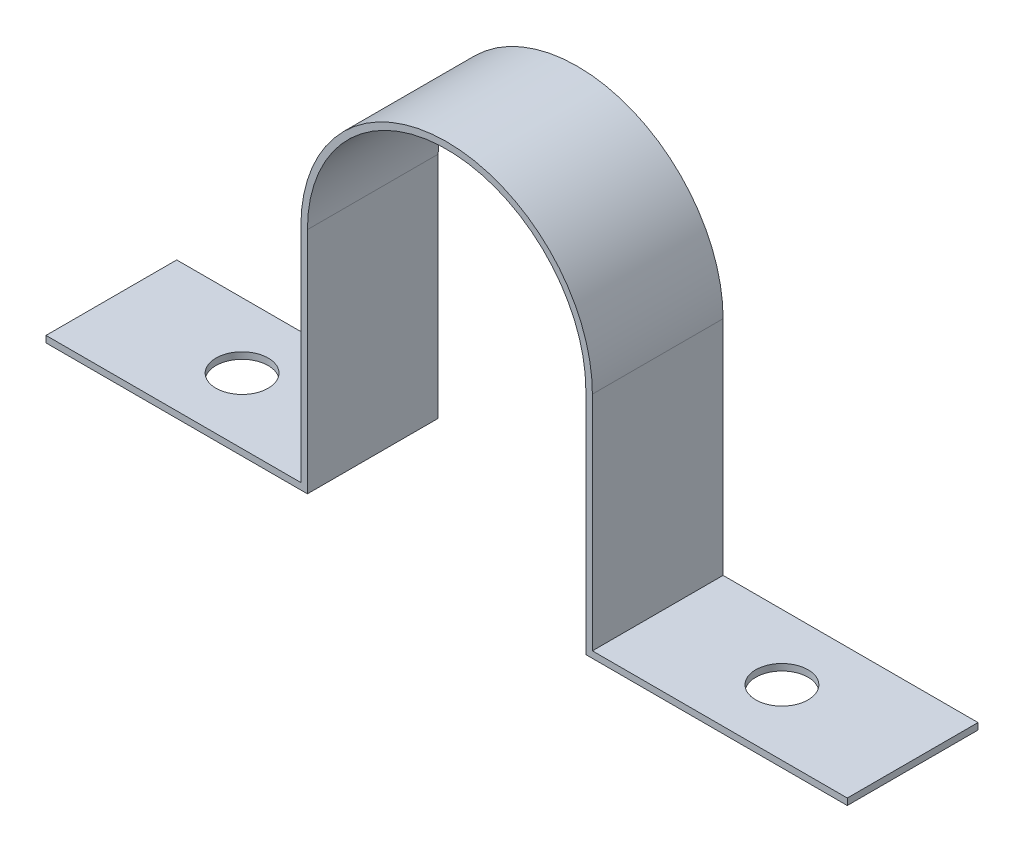
ISO-10303-21;
HEADER;
FILE_DESCRIPTION(('STEP AP214'),'2;1');
FILE_NAME('part.step','',(''),(''),'','','');
FILE_SCHEMA(('AUTOMOTIVE_DESIGN { 1 0 10303 214 1 1 1 1 }'));
ENDSEC;
DATA;
#1=APPLICATION_CONTEXT('core data for automotive mechanical design processes');
#2=APPLICATION_PROTOCOL_DEFINITION('international standard','automotive_design',2000,#1);
#3=PRODUCT_CONTEXT('',#1,'mechanical');
#4=PRODUCT('Part','Part','',(#3));
#5=PRODUCT_RELATED_PRODUCT_CATEGORY('part','',(#4));
#6=PRODUCT_DEFINITION_FORMATION('','',#4);
#7=PRODUCT_DEFINITION_CONTEXT('part definition',#1,'design');
#8=PRODUCT_DEFINITION('design','',#6,#7);
#9=PRODUCT_DEFINITION_SHAPE('','',#8);
#10=(LENGTH_UNIT() NAMED_UNIT(*) SI_UNIT(.MILLI.,.METRE.));
#11=(NAMED_UNIT(*) PLANE_ANGLE_UNIT() SI_UNIT($,.RADIAN.));
#12=(NAMED_UNIT(*) SI_UNIT($,.STERADIAN.) SOLID_ANGLE_UNIT());
#13=UNCERTAINTY_MEASURE_WITH_UNIT(LENGTH_MEASURE(1.E-05),#10,'distance_accuracy_value','');
#14=(GEOMETRIC_REPRESENTATION_CONTEXT(3) GLOBAL_UNCERTAINTY_ASSIGNED_CONTEXT((#13)) GLOBAL_UNIT_ASSIGNED_CONTEXT((#10,
#11,#12)) REPRESENTATION_CONTEXT('',''));
#15=CARTESIAN_POINT('',(0.,0.,0.));
#16=DIRECTION('',(0.,0.,1.));
#17=DIRECTION('',(1.,0.,0.));
#18=AXIS2_PLACEMENT_3D('',#15,#16,#17);
#19=CARTESIAN_POINT('',(0.,0.,10.));
#20=DIRECTION('',(0.,0.,-1.));
#21=DIRECTION('',(-1.,0.,0.));
#22=AXIS2_PLACEMENT_3D('',#19,#20,#21);
#23=CYLINDRICAL_SURFACE('',#22,11.15);
#24=CARTESIAN_POINT('',(0.,0.,0.));
#25=DIRECTION('',(0.,0.,1.));
#26=DIRECTION('',(1.,0.,0.));
#27=AXIS2_PLACEMENT_3D('',#24,#25,#26);
#28=CIRCLE('',#27,11.15);
#29=CARTESIAN_POINT('',(11.15,0.,0.));
#30=VERTEX_POINT('',#29);
#31=CARTESIAN_POINT('',(-11.15,0.,0.));
#32=VERTEX_POINT('',#31);
#33=EDGE_CURVE('E155',#30,#32,#28,.T.);
#34=ORIENTED_EDGE('',*,*,#33,.T.);
#35=DIRECTION('',(0.,0.,-1.));
#36=VECTOR('',#35,1.);
#37=CARTESIAN_POINT('',(-11.15,0.,10.));
#38=LINE('',#37,#36);
#39=CARTESIAN_POINT('',(-11.15,0.,10.));
#40=VERTEX_POINT('',#39);
#41=EDGE_CURVE('E11',#40,#32,#38,.T.);
#42=ORIENTED_EDGE('',*,*,#41,.F.);
#43=CARTESIAN_POINT('',(0.,0.,10.));
#44=DIRECTION('',(0.,0.,1.));
#45=DIRECTION('',(1.,0.,0.));
#46=AXIS2_PLACEMENT_3D('',#43,#44,#45);
#47=CIRCLE('',#46,11.15);
#48=CARTESIAN_POINT('',(11.15,0.,10.));
#49=VERTEX_POINT('',#48);
#50=EDGE_CURVE('E177',#49,#40,#47,.T.);
#51=ORIENTED_EDGE('',*,*,#50,.F.);
#52=DIRECTION('',(0.,0.,-1.));
#53=VECTOR('',#52,1.);
#54=CARTESIAN_POINT('',(11.15,0.,10.));
#55=LINE('',#54,#53);
#56=EDGE_CURVE('E151',#49,#30,#55,.T.);
#57=ORIENTED_EDGE('',*,*,#56,.T.);
#58=EDGE_LOOP('',(#34,#42,#51,#57));
#59=FACE_BOUND('',#58,.T.);
#60=ADVANCED_FACE('F34',(#59),#23,.T.);
#61=CARTESIAN_POINT('',(-11.15,0.,10.));
#62=DIRECTION('',(1.,0.,0.));
#63=DIRECTION('',(0.,1.,0.));
#64=AXIS2_PLACEMENT_3D('',#61,#62,#63);
#65=PLANE('',#64);
#66=DIRECTION('',(0.,-1.,0.));
#67=VECTOR('',#66,1.);
#68=CARTESIAN_POINT('',(-11.15,0.,0.));
#69=LINE('',#68,#67);
#70=CARTESIAN_POINT('',(-11.15,-17.0073513516949,0.));
#71=VERTEX_POINT('',#70);
#72=EDGE_CURVE('E158',#32,#71,#69,.T.);
#73=ORIENTED_EDGE('',*,*,#72,.T.);
#74=DIRECTION('',(0.,0.,-1.));
#75=VECTOR('',#74,1.);
#76=CARTESIAN_POINT('',(-11.15,-17.0073513516949,10.));
#77=LINE('',#76,#75);
#78=CARTESIAN_POINT('',(-11.15,-17.0073513516949,10.));
#79=VERTEX_POINT('',#78);
#80=EDGE_CURVE('E43',#79,#71,#77,.T.);
#81=ORIENTED_EDGE('',*,*,#80,.F.);
#82=DIRECTION('',(0.,-1.,0.));
#83=VECTOR('',#82,1.);
#84=CARTESIAN_POINT('',(-11.15,0.,10.));
#85=LINE('',#84,#83);
#86=EDGE_CURVE('E106',#40,#79,#85,.T.);
#87=ORIENTED_EDGE('',*,*,#86,.F.);
#88=ORIENTED_EDGE('',*,*,#41,.T.);
#89=EDGE_LOOP('',(#73,#81,#87,#88));
#90=FACE_BOUND('',#89,.T.);
#91=ADVANCED_FACE('F257',(#90),#65,.F.);
#92=CARTESIAN_POINT('',(-30.65,-17.0073513516949,10.));
#93=DIRECTION('',(0.,-1.,0.));
#94=DIRECTION('',(0.,0.,-1.));
#95=AXIS2_PLACEMENT_3D('',#92,#93,#94);
#96=PLANE('',#95);
#97=CARTESIAN_POINT('',(-20.65,-17.0073513516949,5.));
#98=DIRECTION('',(0.,1.,0.));
#99=DIRECTION('',(0.,0.,1.));
#100=AXIS2_PLACEMENT_3D('',#97,#98,#99);
#101=CIRCLE('',#100,2.);
#102=CARTESIAN_POINT('',(-20.65,-17.0073513516949,7.));
#103=VERTEX_POINT('',#102);
#104=EDGE_CURVE('E388',#103,#103,#101,.T.);
#105=ORIENTED_EDGE('',*,*,#104,.F.);
#106=EDGE_LOOP('',(#105));
#107=FACE_BOUND('',#106,.T.);
#108=DIRECTION('',(-1.,0.,0.));
#109=VECTOR('',#108,1.);
#110=CARTESIAN_POINT('',(-30.65,-17.0073513516949,0.));
#111=LINE('',#110,#109);
#112=CARTESIAN_POINT('',(-30.65,-17.0073513516949,0.));
#113=VERTEX_POINT('',#112);
#114=EDGE_CURVE('E160',#71,#113,#111,.T.);
#115=ORIENTED_EDGE('',*,*,#114,.T.);
#116=DIRECTION('',(0.,0.,-1.));
#117=VECTOR('',#116,1.);
#118=CARTESIAN_POINT('',(-30.65,-17.0073513516949,10.));
#119=LINE('',#118,#117);
#120=CARTESIAN_POINT('',(-30.65,-17.0073513516949,10.));
#121=VERTEX_POINT('',#120);
#122=EDGE_CURVE('E196',#121,#113,#119,.T.);
#123=ORIENTED_EDGE('',*,*,#122,.F.);
#124=DIRECTION('',(-1.,0.,0.));
#125=VECTOR('',#124,1.);
#126=CARTESIAN_POINT('',(-30.65,-17.0073513516949,10.));
#127=LINE('',#126,#125);
#128=EDGE_CURVE('E205',#79,#121,#127,.T.);
#129=ORIENTED_EDGE('',*,*,#128,.F.);
#130=ORIENTED_EDGE('',*,*,#80,.T.);
#131=EDGE_LOOP('',(#115,#123,#129,#130));
#132=FACE_BOUND('',#131,.T.);
#133=ADVANCED_FACE('F203',(#107,#132),#96,.F.);
#134=CARTESIAN_POINT('',(-30.65,-17.5073513516949,10.));
#135=DIRECTION('',(1.,0.,0.));
#136=DIRECTION('',(0.,1.,0.));
#137=AXIS2_PLACEMENT_3D('',#134,#135,#136);
#138=PLANE('',#137);
#139=DIRECTION('',(0.,-1.,0.));
#140=VECTOR('',#139,1.);
#141=CARTESIAN_POINT('',(-30.65,-17.5073513516949,0.));
#142=LINE('',#141,#140);
#143=CARTESIAN_POINT('',(-30.65,-17.5073513516949,0.));
#144=VERTEX_POINT('',#143);
#145=EDGE_CURVE('E162',#113,#144,#142,.T.);
#146=ORIENTED_EDGE('',*,*,#145,.T.);
#147=DIRECTION('',(0.,0.,-1.));
#148=VECTOR('',#147,1.);
#149=CARTESIAN_POINT('',(-30.65,-17.5073513516949,10.));
#150=LINE('',#149,#148);
#151=CARTESIAN_POINT('',(-30.65,-17.5073513516949,10.));
#152=VERTEX_POINT('',#151);
#153=EDGE_CURVE('E193',#152,#144,#150,.T.);
#154=ORIENTED_EDGE('',*,*,#153,.F.);
#155=DIRECTION('',(0.,-1.,0.));
#156=VECTOR('',#155,1.);
#157=CARTESIAN_POINT('',(-30.65,-17.5073513516949,10.));
#158=LINE('',#157,#156);
#159=EDGE_CURVE('E223',#121,#152,#158,.T.);
#160=ORIENTED_EDGE('',*,*,#159,.F.);
#161=ORIENTED_EDGE('',*,*,#122,.T.);
#162=EDGE_LOOP('',(#146,#154,#160,#161));
#163=FACE_BOUND('',#162,.T.);
#164=ADVANCED_FACE('F214',(#163),#138,.F.);
#165=CARTESIAN_POINT('',(-10.65,-17.5073513516949,10.));
#166=DIRECTION('',(0.,1.,0.));
#167=DIRECTION('',(-1.,0.,0.));
#168=AXIS2_PLACEMENT_3D('',#165,#166,#167);
#169=PLANE('',#168);
#170=CARTESIAN_POINT('',(-20.65,-17.5073513516949,5.));
#171=DIRECTION('',(0.,1.,0.));
#172=DIRECTION('',(-1.,0.,0.));
#173=AXIS2_PLACEMENT_3D('',#170,#171,#172);
#174=CIRCLE('',#173,2.);
#175=CARTESIAN_POINT('',(-22.65,-17.5073513516949,5.));
#176=VERTEX_POINT('',#175);
#177=EDGE_CURVE('E37',#176,#176,#174,.T.);
#178=ORIENTED_EDGE('',*,*,#177,.T.);
#179=EDGE_LOOP('',(#178));
#180=FACE_BOUND('',#179,.T.);
#181=DIRECTION('',(1.,0.,0.));
#182=VECTOR('',#181,1.);
#183=CARTESIAN_POINT('',(-10.65,-17.5073513516949,0.));
#184=LINE('',#183,#182);
#185=CARTESIAN_POINT('',(-10.65,-17.5073513516949,0.));
#186=VERTEX_POINT('',#185);
#187=EDGE_CURVE('E164',#144,#186,#184,.T.);
#188=ORIENTED_EDGE('',*,*,#187,.T.);
#189=DIRECTION('',(0.,0.,-1.));
#190=VECTOR('',#189,1.);
#191=CARTESIAN_POINT('',(-10.65,-17.5073513516949,10.));
#192=LINE('',#191,#190);
#193=CARTESIAN_POINT('',(-10.65,-17.5073513516949,10.));
#194=VERTEX_POINT('',#193);
#195=EDGE_CURVE('E190',#194,#186,#192,.T.);
#196=ORIENTED_EDGE('',*,*,#195,.F.);
#197=DIRECTION('',(1.,0.,0.));
#198=VECTOR('',#197,1.);
#199=CARTESIAN_POINT('',(-10.65,-17.5073513516949,10.));
#200=LINE('',#199,#198);
#201=EDGE_CURVE('E220',#152,#194,#200,.T.);
#202=ORIENTED_EDGE('',*,*,#201,.F.);
#203=ORIENTED_EDGE('',*,*,#153,.T.);
#204=EDGE_LOOP('',(#188,#196,#202,#203));
#205=FACE_BOUND('',#204,.T.);
#206=ADVANCED_FACE('F218',(#180,#205),#169,.F.);
#207=CARTESIAN_POINT('',(-10.65,0.,10.));
#208=DIRECTION('',(-1.,0.,0.));
#209=DIRECTION('',(0.,0.,1.));
#210=AXIS2_PLACEMENT_3D('',#207,#208,#209);
#211=PLANE('',#210);
#212=DIRECTION('',(0.,1.,0.));
#213=VECTOR('',#212,1.);
#214=CARTESIAN_POINT('',(-10.65,0.,0.));
#215=LINE('',#214,#213);
#216=CARTESIAN_POINT('',(-10.65,0.,0.));
#217=VERTEX_POINT('',#216);
#218=EDGE_CURVE('E166',#186,#217,#215,.T.);
#219=ORIENTED_EDGE('',*,*,#218,.T.);
#220=DIRECTION('',(0.,0.,-1.));
#221=VECTOR('',#220,1.);
#222=CARTESIAN_POINT('',(-10.65,0.,10.));
#223=LINE('',#222,#221);
#224=CARTESIAN_POINT('',(-10.65,0.,10.));
#225=VERTEX_POINT('',#224);
#226=EDGE_CURVE('E187',#225,#217,#223,.T.);
#227=ORIENTED_EDGE('',*,*,#226,.F.);
#228=DIRECTION('',(0.,1.,0.));
#229=VECTOR('',#228,1.);
#230=CARTESIAN_POINT('',(-10.65,0.,10.));
#231=LINE('',#230,#229);
#232=EDGE_CURVE('E222',#194,#225,#231,.T.);
#233=ORIENTED_EDGE('',*,*,#232,.F.);
#234=ORIENTED_EDGE('',*,*,#195,.T.);
#235=EDGE_LOOP('',(#219,#227,#233,#234));
#236=FACE_BOUND('',#235,.T.);
#237=ADVANCED_FACE('F271',(#236),#211,.F.);
#238=CARTESIAN_POINT('',(0.,0.,10.));
#239=DIRECTION('',(0.,0.,-1.));
#240=DIRECTION('',(-1.,0.,0.));
#241=AXIS2_PLACEMENT_3D('',#238,#239,#240);
#242=CYLINDRICAL_SURFACE('',#241,10.65);
#243=CARTESIAN_POINT('',(0.,0.,0.));
#244=DIRECTION('',(0.,0.,-1.));
#245=DIRECTION('',(1.,0.,0.));
#246=AXIS2_PLACEMENT_3D('',#243,#244,#245);
#247=CIRCLE('',#246,10.65);
#248=CARTESIAN_POINT('',(10.65,0.,0.));
#249=VERTEX_POINT('',#248);
#250=EDGE_CURVE('E168',#217,#249,#247,.T.);
#251=ORIENTED_EDGE('',*,*,#250,.T.);
#252=DIRECTION('',(0.,0.,-1.));
#253=VECTOR('',#252,1.);
#254=CARTESIAN_POINT('',(10.65,0.,10.));
#255=LINE('',#254,#253);
#256=CARTESIAN_POINT('',(10.65,0.,10.));
#257=VERTEX_POINT('',#256);
#258=EDGE_CURVE('E184',#257,#249,#255,.T.);
#259=ORIENTED_EDGE('',*,*,#258,.F.);
#260=CARTESIAN_POINT('',(0.,0.,10.));
#261=DIRECTION('',(0.,0.,-1.));
#262=DIRECTION('',(1.,0.,0.));
#263=AXIS2_PLACEMENT_3D('',#260,#261,#262);
#264=CIRCLE('',#263,10.65);
#265=EDGE_CURVE('E225',#225,#257,#264,.T.);
#266=ORIENTED_EDGE('',*,*,#265,.F.);
#267=ORIENTED_EDGE('',*,*,#226,.T.);
#268=EDGE_LOOP('',(#251,#259,#266,#267));
#269=FACE_BOUND('',#268,.T.);
#270=ADVANCED_FACE('F275',(#269),#242,.F.);
#271=CARTESIAN_POINT('',(10.65,0.,10.));
#272=DIRECTION('',(1.,0.,0.));
#273=DIRECTION('',(0.,1.,0.));
#274=AXIS2_PLACEMENT_3D('',#271,#272,#273);
#275=PLANE('',#274);
#276=DIRECTION('',(0.,-1.,0.));
#277=VECTOR('',#276,1.);
#278=CARTESIAN_POINT('',(10.65,0.,0.));
#279=LINE('',#278,#277);
#280=CARTESIAN_POINT('',(10.65,-17.5073513516949,0.));
#281=VERTEX_POINT('',#280);
#282=EDGE_CURVE('E170',#249,#281,#279,.T.);
#283=ORIENTED_EDGE('',*,*,#282,.T.);
#284=DIRECTION('',(0.,0.,-1.));
#285=VECTOR('',#284,1.);
#286=CARTESIAN_POINT('',(10.65,-17.5073513516949,10.));
#287=LINE('',#286,#285);
#288=CARTESIAN_POINT('',(10.65,-17.5073513516949,10.));
#289=VERTEX_POINT('',#288);
#290=EDGE_CURVE('E181',#289,#281,#287,.T.);
#291=ORIENTED_EDGE('',*,*,#290,.F.);
#292=DIRECTION('',(0.,-1.,0.));
#293=VECTOR('',#292,1.);
#294=CARTESIAN_POINT('',(10.65,0.,10.));
#295=LINE('',#294,#293);
#296=EDGE_CURVE('E231',#257,#289,#295,.T.);
#297=ORIENTED_EDGE('',*,*,#296,.F.);
#298=ORIENTED_EDGE('',*,*,#258,.T.);
#299=EDGE_LOOP('',(#283,#291,#297,#298));
#300=FACE_BOUND('',#299,.T.);
#301=ADVANCED_FACE('F237',(#300),#275,.F.);
#302=CARTESIAN_POINT('',(10.65,-17.5073513516949,10.));
#303=DIRECTION('',(0.,1.,0.));
#304=DIRECTION('',(-1.,0.,0.));
#305=AXIS2_PLACEMENT_3D('',#302,#303,#304);
#306=PLANE('',#305);
#307=CARTESIAN_POINT('',(20.65,-17.5073513516949,5.));
#308=DIRECTION('',(0.,1.,0.));
#309=DIRECTION('',(-1.,0.,0.));
#310=AXIS2_PLACEMENT_3D('',#307,#308,#309);
#311=CIRCLE('',#310,2.);
#312=CARTESIAN_POINT('',(18.65,-17.5073513516949,5.));
#313=VERTEX_POINT('',#312);
#314=EDGE_CURVE('E391',#313,#313,#311,.T.);
#315=ORIENTED_EDGE('',*,*,#314,.T.);
#316=EDGE_LOOP('',(#315));
#317=FACE_BOUND('',#316,.T.);
#318=DIRECTION('',(1.,0.,0.));
#319=VECTOR('',#318,1.);
#320=CARTESIAN_POINT('',(10.65,-17.5073513516949,0.));
#321=LINE('',#320,#319);
#322=CARTESIAN_POINT('',(30.65,-17.5073513516949,0.));
#323=VERTEX_POINT('',#322);
#324=EDGE_CURVE('E172',#281,#323,#321,.T.);
#325=ORIENTED_EDGE('',*,*,#324,.T.);
#326=DIRECTION('',(0.,0.,-1.));
#327=VECTOR('',#326,1.);
#328=CARTESIAN_POINT('',(30.65,-17.5073513516949,10.));
#329=LINE('',#328,#327);
#330=CARTESIAN_POINT('',(30.65,-17.5073513516949,10.));
#331=VERTEX_POINT('',#330);
#332=EDGE_CURVE('E146',#331,#323,#329,.T.);
#333=ORIENTED_EDGE('',*,*,#332,.F.);
#334=DIRECTION('',(1.,0.,0.));
#335=VECTOR('',#334,1.);
#336=CARTESIAN_POINT('',(10.65,-17.5073513516949,10.));
#337=LINE('',#336,#335);
#338=EDGE_CURVE('E137',#289,#331,#337,.T.);
#339=ORIENTED_EDGE('',*,*,#338,.F.);
#340=ORIENTED_EDGE('',*,*,#290,.T.);
#341=EDGE_LOOP('',(#325,#333,#339,#340));
#342=FACE_BOUND('',#341,.T.);
#343=ADVANCED_FACE('F241',(#317,#342),#306,.F.);
#344=CARTESIAN_POINT('',(30.65,-17.5073513516949,10.));
#345=DIRECTION('',(-1.,0.,0.));
#346=DIRECTION('',(0.,-1.,0.));
#347=AXIS2_PLACEMENT_3D('',#344,#345,#346);
#348=PLANE('',#347);
#349=DIRECTION('',(0.,1.,0.));
#350=VECTOR('',#349,1.);
#351=CARTESIAN_POINT('',(30.65,-17.5073513516949,0.));
#352=LINE('',#351,#350);
#353=CARTESIAN_POINT('',(30.65,-17.0073513516949,0.));
#354=VERTEX_POINT('',#353);
#355=EDGE_CURVE('E145',#323,#354,#352,.T.);
#356=ORIENTED_EDGE('',*,*,#355,.T.);
#357=DIRECTION('',(0.,0.,-1.));
#358=VECTOR('',#357,1.);
#359=CARTESIAN_POINT('',(30.65,-17.0073513516949,10.));
#360=LINE('',#359,#358);
#361=CARTESIAN_POINT('',(30.65,-17.0073513516949,10.));
#362=VERTEX_POINT('',#361);
#363=EDGE_CURVE('E142',#362,#354,#360,.T.);
#364=ORIENTED_EDGE('',*,*,#363,.F.);
#365=DIRECTION('',(0.,1.,0.));
#366=VECTOR('',#365,1.);
#367=CARTESIAN_POINT('',(30.65,-17.5073513516949,10.));
#368=LINE('',#367,#366);
#369=EDGE_CURVE('E131',#331,#362,#368,.T.);
#370=ORIENTED_EDGE('',*,*,#369,.F.);
#371=ORIENTED_EDGE('',*,*,#332,.T.);
#372=EDGE_LOOP('',(#356,#364,#370,#371));
#373=FACE_BOUND('',#372,.T.);
#374=ADVANCED_FACE('F143',(#373),#348,.F.);
#375=CARTESIAN_POINT('',(30.65,-17.0073513516949,10.));
#376=DIRECTION('',(0.,-1.,0.));
#377=DIRECTION('',(0.,0.,-1.));
#378=AXIS2_PLACEMENT_3D('',#375,#376,#377);
#379=PLANE('',#378);
#380=CARTESIAN_POINT('',(20.65,-17.0073513516949,5.));
#381=DIRECTION('',(0.,1.,0.));
#382=DIRECTION('',(0.,0.,-1.));
#383=AXIS2_PLACEMENT_3D('',#380,#381,#382);
#384=CIRCLE('',#383,2.);
#385=CARTESIAN_POINT('',(20.65,-17.0073513516949,3.));
#386=VERTEX_POINT('',#385);
#387=EDGE_CURVE('E395',#386,#386,#384,.T.);
#388=ORIENTED_EDGE('',*,*,#387,.F.);
#389=EDGE_LOOP('',(#388));
#390=FACE_BOUND('',#389,.T.);
#391=DIRECTION('',(-1.,0.,0.));
#392=VECTOR('',#391,1.);
#393=CARTESIAN_POINT('',(30.65,-17.0073513516949,0.));
#394=LINE('',#393,#392);
#395=CARTESIAN_POINT('',(11.15,-17.0073513516949,0.));
#396=VERTEX_POINT('',#395);
#397=EDGE_CURVE('E92',#354,#396,#394,.T.);
#398=ORIENTED_EDGE('',*,*,#397,.T.);
#399=DIRECTION('',(0.,0.,-1.));
#400=VECTOR('',#399,1.);
#401=CARTESIAN_POINT('',(11.15,-17.0073513516949,10.));
#402=LINE('',#401,#400);
#403=CARTESIAN_POINT('',(11.15,-17.0073513516949,10.));
#404=VERTEX_POINT('',#403);
#405=EDGE_CURVE('E147',#404,#396,#402,.T.);
#406=ORIENTED_EDGE('',*,*,#405,.F.);
#407=DIRECTION('',(-1.,0.,0.));
#408=VECTOR('',#407,1.);
#409=CARTESIAN_POINT('',(30.65,-17.0073513516949,10.));
#410=LINE('',#409,#408);
#411=EDGE_CURVE('E135',#362,#404,#410,.T.);
#412=ORIENTED_EDGE('',*,*,#411,.F.);
#413=ORIENTED_EDGE('',*,*,#363,.T.);
#414=EDGE_LOOP('',(#398,#406,#412,#413));
#415=FACE_BOUND('',#414,.T.);
#416=ADVANCED_FACE('F149',(#390,#415),#379,.F.);
#417=CARTESIAN_POINT('',(11.15,0.,10.));
#418=DIRECTION('',(-1.,0.,0.));
#419=DIRECTION('',(0.,-1.,0.));
#420=AXIS2_PLACEMENT_3D('',#417,#418,#419);
#421=PLANE('',#420);
#422=DIRECTION('',(0.,1.,0.));
#423=VECTOR('',#422,1.);
#424=CARTESIAN_POINT('',(11.15,0.,0.));
#425=LINE('',#424,#423);
#426=EDGE_CURVE('E98',#396,#30,#425,.T.);
#427=ORIENTED_EDGE('',*,*,#426,.T.);
#428=ORIENTED_EDGE('',*,*,#56,.F.);
#429=DIRECTION('',(0.,1.,0.));
#430=VECTOR('',#429,1.);
#431=CARTESIAN_POINT('',(11.15,0.,10.));
#432=LINE('',#431,#430);
#433=EDGE_CURVE('E51',#404,#49,#432,.T.);
#434=ORIENTED_EDGE('',*,*,#433,.F.);
#435=ORIENTED_EDGE('',*,*,#405,.T.);
#436=EDGE_LOOP('',(#427,#428,#434,#435));
#437=FACE_BOUND('',#436,.T.);
#438=ADVANCED_FACE('F245',(#437),#421,.F.);
#439=CARTESIAN_POINT('',(0.,0.,10.));
#440=DIRECTION('',(0.,0.,1.));
#441=DIRECTION('',(1.,0.,0.));
#442=AXIS2_PLACEMENT_3D('',#439,#440,#441);
#443=PLANE('',#442);
#444=ORIENTED_EDGE('',*,*,#50,.T.);
#445=ORIENTED_EDGE('',*,*,#86,.T.);
#446=ORIENTED_EDGE('',*,*,#128,.T.);
#447=ORIENTED_EDGE('',*,*,#159,.T.);
#448=ORIENTED_EDGE('',*,*,#201,.T.);
#449=ORIENTED_EDGE('',*,*,#232,.T.);
#450=ORIENTED_EDGE('',*,*,#265,.T.);
#451=ORIENTED_EDGE('',*,*,#296,.T.);
#452=ORIENTED_EDGE('',*,*,#338,.T.);
#453=ORIENTED_EDGE('',*,*,#369,.T.);
#454=ORIENTED_EDGE('',*,*,#411,.T.);
#455=ORIENTED_EDGE('',*,*,#433,.T.);
#456=EDGE_LOOP('',(#444,#445,#446,#447,#448,#449,#450,#451,#452,#453,#454,#455));
#457=FACE_BOUND('',#456,.T.);
#458=ADVANCED_FACE('F133',(#457),#443,.T.);
#459=CARTESIAN_POINT('',(0.,0.,0.));
#460=DIRECTION('',(0.,0.,1.));
#461=DIRECTION('',(1.,0.,0.));
#462=AXIS2_PLACEMENT_3D('',#459,#460,#461);
#463=PLANE('',#462);
#464=ORIENTED_EDGE('',*,*,#33,.F.);
#465=ORIENTED_EDGE('',*,*,#426,.F.);
#466=ORIENTED_EDGE('',*,*,#397,.F.);
#467=ORIENTED_EDGE('',*,*,#355,.F.);
#468=ORIENTED_EDGE('',*,*,#324,.F.);
#469=ORIENTED_EDGE('',*,*,#282,.F.);
#470=ORIENTED_EDGE('',*,*,#250,.F.);
#471=ORIENTED_EDGE('',*,*,#218,.F.);
#472=ORIENTED_EDGE('',*,*,#187,.F.);
#473=ORIENTED_EDGE('',*,*,#145,.F.);
#474=ORIENTED_EDGE('',*,*,#114,.F.);
#475=ORIENTED_EDGE('',*,*,#72,.F.);
#476=EDGE_LOOP('',(#464,#465,#466,#467,#468,#469,#470,#471,#472,#473,#474,#475));
#477=FACE_BOUND('',#476,.T.);
#478=ADVANCED_FACE('F209',(#477),#463,.F.);
#479=CARTESIAN_POINT('',(20.65,-27.0073513516949,5.));
#480=DIRECTION('',(0.,1.,0.));
#481=DIRECTION('',(0.,0.,1.));
#482=AXIS2_PLACEMENT_3D('',#479,#480,#481);
#483=CYLINDRICAL_SURFACE('',#482,2.);
#484=ORIENTED_EDGE('',*,*,#387,.T.);
#485=EDGE_LOOP('',(#484));
#486=FACE_BOUND('',#485,.T.);
#487=ORIENTED_EDGE('',*,*,#314,.F.);
#488=EDGE_LOOP('',(#487));
#489=FACE_BOUND('',#488,.T.);
#490=ADVANCED_FACE('F304',(#486,#489),#483,.F.);
#491=CARTESIAN_POINT('',(-20.65,-27.0073513516949,5.));
#492=DIRECTION('',(0.,1.,0.));
#493=DIRECTION('',(0.,0.,1.));
#494=AXIS2_PLACEMENT_3D('',#491,#492,#493);
#495=CYLINDRICAL_SURFACE('',#494,2.);
#496=ORIENTED_EDGE('',*,*,#104,.T.);
#497=EDGE_LOOP('',(#496));
#498=FACE_BOUND('',#497,.T.);
#499=ORIENTED_EDGE('',*,*,#177,.F.);
#500=EDGE_LOOP('',(#499));
#501=FACE_BOUND('',#500,.T.);
#502=ADVANCED_FACE('F309',(#498,#501),#495,.F.);
#503=CLOSED_SHELL('',(#60,#91,#133,#164,#206,#237,#270,#301,#343,#374,#416,#438,#458,#478,#490,#502));
#504=MANIFOLD_SOLID_BREP('B2',#503);
#505=ADVANCED_BREP_SHAPE_REPRESENTATION('',(#18,#504),#14);
#506=SHAPE_DEFINITION_REPRESENTATION(#9,#505);
ENDSEC;
END-ISO-10303-21;
